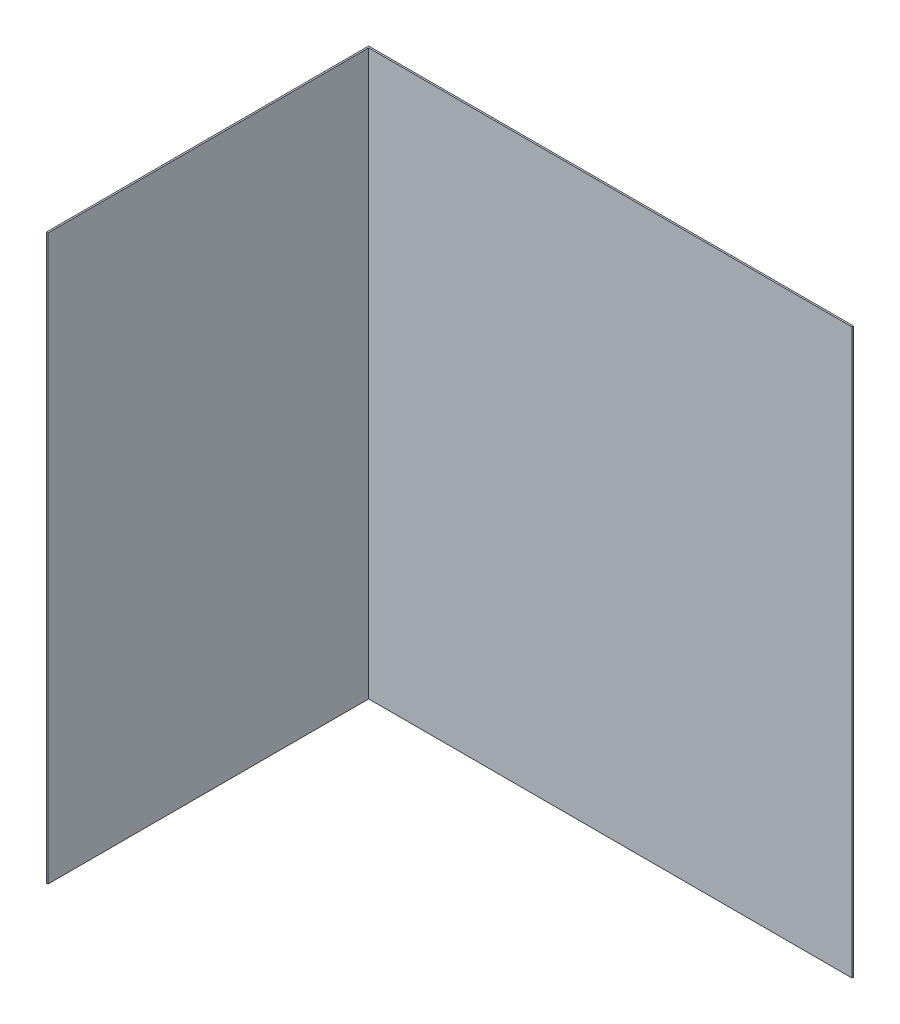
ISO-10303-21;
HEADER;
FILE_DESCRIPTION(('STEP AP214'),'2;1');
FILE_NAME('part.step','',(''),(''),'','','');
FILE_SCHEMA(('AUTOMOTIVE_DESIGN { 1 0 10303 214 1 1 1 1 }'));
ENDSEC;
DATA;
#1=APPLICATION_CONTEXT('core data for automotive mechanical design processes');
#2=APPLICATION_PROTOCOL_DEFINITION('international standard','automotive_design',2000,#1);
#3=PRODUCT_CONTEXT('',#1,'mechanical');
#4=PRODUCT('Part','Part','',(#3));
#5=PRODUCT_RELATED_PRODUCT_CATEGORY('part','',(#4));
#6=PRODUCT_DEFINITION_FORMATION('','',#4);
#7=PRODUCT_DEFINITION_CONTEXT('part definition',#1,'design');
#8=PRODUCT_DEFINITION('design','',#6,#7);
#9=PRODUCT_DEFINITION_SHAPE('','',#8);
#10=(LENGTH_UNIT() NAMED_UNIT(*) SI_UNIT(.MILLI.,.METRE.));
#11=(NAMED_UNIT(*) PLANE_ANGLE_UNIT() SI_UNIT($,.RADIAN.));
#12=(NAMED_UNIT(*) SI_UNIT($,.STERADIAN.) SOLID_ANGLE_UNIT());
#13=UNCERTAINTY_MEASURE_WITH_UNIT(LENGTH_MEASURE(1.E-05),#10,'distance_accuracy_value','');
#14=(GEOMETRIC_REPRESENTATION_CONTEXT(3) GLOBAL_UNCERTAINTY_ASSIGNED_CONTEXT((#13)) GLOBAL_UNIT_ASSIGNED_CONTEXT((#10,
#11,#12)) REPRESENTATION_CONTEXT('',''));
#15=CARTESIAN_POINT('',(0.,0.,0.));
#16=DIRECTION('',(0.,0.,1.));
#17=DIRECTION('',(1.,0.,0.));
#18=AXIS2_PLACEMENT_3D('',#15,#16,#17);
#19=CARTESIAN_POINT('',(0.,0.,0.2));
#20=DIRECTION('',(0.,0.,-1.));
#21=DIRECTION('',(-1.,0.,0.));
#22=AXIS2_PLACEMENT_3D('',#19,#20,#21);
#23=PLANE('',#22);
#24=DIRECTION('',(-1.,0.,0.));
#25=VECTOR('',#24,1.);
#26=CARTESIAN_POINT('',(0.,0.35,0.2));
#27=LINE('',#26,#25);
#28=CARTESIAN_POINT('',(0.,0.35,0.2));
#29=VERTEX_POINT('',#28);
#30=CARTESIAN_POINT('',(-0.00100000000000002,0.35,0.2));
#31=VERTEX_POINT('',#30);
#32=EDGE_CURVE('E88',#29,#31,#27,.T.);
#33=ORIENTED_EDGE('',*,*,#32,.T.);
#34=DIRECTION('',(0.,1.,0.));
#35=VECTOR('',#34,1.);
#36=CARTESIAN_POINT('',(-0.00100000000000004,0.,0.2));
#37=LINE('',#36,#35);
#38=CARTESIAN_POINT('',(-0.00100000000000004,0.,0.2));
#39=VERTEX_POINT('',#38);
#40=EDGE_CURVE('E72',#31,#39,#37,.F.);
#41=ORIENTED_EDGE('',*,*,#40,.T.);
#42=DIRECTION('',(-1.,0.,0.));
#43=VECTOR('',#42,1.);
#44=CARTESIAN_POINT('',(0.,0.,0.2));
#45=LINE('',#44,#43);
#46=CARTESIAN_POINT('',(0.,0.,0.2));
#47=VERTEX_POINT('',#46);
#48=EDGE_CURVE('E20',#39,#47,#45,.F.);
#49=ORIENTED_EDGE('',*,*,#48,.T.);
#50=DIRECTION('',(0.,1.,0.));
#51=VECTOR('',#50,1.);
#52=CARTESIAN_POINT('',(0.,0.,0.2));
#53=LINE('',#52,#51);
#54=EDGE_CURVE('E77',#29,#47,#53,.F.);
#55=ORIENTED_EDGE('',*,*,#54,.F.);
#56=EDGE_LOOP('',(#33,#41,#49,#55));
#57=FACE_BOUND('',#56,.T.);
#58=ADVANCED_FACE('F17',(#57),#23,.F.);
#59=CARTESIAN_POINT('',(0.,0.,0.));
#60=DIRECTION('',(1.,0.,0.));
#61=DIRECTION('',(0.,0.,-1.));
#62=AXIS2_PLACEMENT_3D('',#59,#60,#61);
#63=PLANE('',#62);
#64=DIRECTION('',(0.,0.,-1.));
#65=VECTOR('',#64,1.);
#66=CARTESIAN_POINT('',(0.,0.35,0.));
#67=LINE('',#66,#65);
#68=CARTESIAN_POINT('',(0.,0.35,0.000999999999999999));
#69=VERTEX_POINT('',#68);
#70=EDGE_CURVE('E111',#69,#29,#67,.F.);
#71=ORIENTED_EDGE('',*,*,#70,.T.);
#72=ORIENTED_EDGE('',*,*,#54,.T.);
#73=DIRECTION('',(0.,0.,-1.));
#74=VECTOR('',#73,1.);
#75=CARTESIAN_POINT('',(0.,0.,0.));
#76=LINE('',#75,#74);
#77=CARTESIAN_POINT('',(0.,0.,0.001));
#78=VERTEX_POINT('',#77);
#79=EDGE_CURVE('E83',#47,#78,#76,.T.);
#80=ORIENTED_EDGE('',*,*,#79,.T.);
#81=DIRECTION('',(0.,1.,0.));
#82=VECTOR('',#81,1.);
#83=CARTESIAN_POINT('',(0.,0.,0.001));
#84=LINE('',#83,#82);
#85=EDGE_CURVE('E100',#78,#69,#84,.T.);
#86=ORIENTED_EDGE('',*,*,#85,.T.);
#87=EDGE_LOOP('',(#71,#72,#80,#86));
#88=FACE_BOUND('',#87,.T.);
#89=ADVANCED_FACE('F112',(#88),#63,.T.);
#90=CARTESIAN_POINT('',(-0.001,0.35,0.));
#91=DIRECTION('',(1.,0.,0.));
#92=DIRECTION('',(0.,0.,-1.));
#93=AXIS2_PLACEMENT_3D('',#90,#91,#92);
#94=PLANE('',#93);
#95=DIRECTION('',(0.,0.,1.));
#96=VECTOR('',#95,1.);
#97=CARTESIAN_POINT('',(-0.001,0.,0.));
#98=LINE('',#97,#96);
#99=CARTESIAN_POINT('',(-0.001,0.,0.));
#100=VERTEX_POINT('',#99);
#101=EDGE_CURVE('E67',#39,#100,#98,.F.);
#102=ORIENTED_EDGE('',*,*,#101,.F.);
#103=ORIENTED_EDGE('',*,*,#40,.F.);
#104=DIRECTION('',(0.,0.,-1.));
#105=VECTOR('',#104,1.);
#106=CARTESIAN_POINT('',(-0.001,0.35,0.));
#107=LINE('',#106,#105);
#108=CARTESIAN_POINT('',(-0.001,0.35,0.));
#109=VERTEX_POINT('',#108);
#110=EDGE_CURVE('E76',#31,#109,#107,.T.);
#111=ORIENTED_EDGE('',*,*,#110,.T.);
#112=DIRECTION('',(0.,1.,0.));
#113=VECTOR('',#112,1.);
#114=CARTESIAN_POINT('',(-0.001,0.,0.));
#115=LINE('',#114,#113);
#116=EDGE_CURVE('E74',#100,#109,#115,.T.);
#117=ORIENTED_EDGE('',*,*,#116,.F.);
#118=EDGE_LOOP('',(#102,#103,#111,#117));
#119=FACE_BOUND('',#118,.T.);
#120=ADVANCED_FACE('F69',(#119),#94,.F.);
#121=CARTESIAN_POINT('',(-0.001,0.,0.001));
#122=DIRECTION('',(0.,0.,-1.));
#123=DIRECTION('',(-1.,0.,0.));
#124=AXIS2_PLACEMENT_3D('',#121,#122,#123);
#125=PLANE('',#124);
#126=DIRECTION('',(1.,0.,0.));
#127=VECTOR('',#126,1.);
#128=CARTESIAN_POINT('',(0.3,0.35,0.001));
#129=LINE('',#128,#127);
#130=CARTESIAN_POINT('',(0.3,0.35,0.001));
#131=VERTEX_POINT('',#130);
#132=EDGE_CURVE('E99',#131,#69,#129,.F.);
#133=ORIENTED_EDGE('',*,*,#132,.T.);
#134=ORIENTED_EDGE('',*,*,#85,.F.);
#135=DIRECTION('',(1.,0.,0.));
#136=VECTOR('',#135,1.);
#137=CARTESIAN_POINT('',(-0.001,0.,0.001));
#138=LINE('',#137,#136);
#139=CARTESIAN_POINT('',(0.3,0.,0.001));
#140=VERTEX_POINT('',#139);
#141=EDGE_CURVE('E102',#78,#140,#138,.T.);
#142=ORIENTED_EDGE('',*,*,#141,.T.);
#143=DIRECTION('',(0.,1.,0.));
#144=VECTOR('',#143,1.);
#145=CARTESIAN_POINT('',(0.3,0.,0.001));
#146=LINE('',#145,#144);
#147=EDGE_CURVE('E95',#140,#131,#146,.T.);
#148=ORIENTED_EDGE('',*,*,#147,.T.);
#149=EDGE_LOOP('',(#133,#134,#142,#148));
#150=FACE_BOUND('',#149,.T.);
#151=ADVANCED_FACE('F114',(#150),#125,.F.);
#152=CARTESIAN_POINT('',(-0.001,0.,0.));
#153=DIRECTION('',(0.,1.,0.));
#154=DIRECTION('',(0.,0.,1.));
#155=AXIS2_PLACEMENT_3D('',#152,#153,#154);
#156=PLANE('',#155);
#157=ORIENTED_EDGE('',*,*,#141,.F.);
#158=ORIENTED_EDGE('',*,*,#79,.F.);
#159=ORIENTED_EDGE('',*,*,#48,.F.);
#160=ORIENTED_EDGE('',*,*,#101,.T.);
#161=DIRECTION('',(-1.,0.,0.));
#162=VECTOR('',#161,1.);
#163=CARTESIAN_POINT('',(-0.001,0.,0.));
#164=LINE('',#163,#162);
#165=CARTESIAN_POINT('',(0.3,0.,0.));
#166=VERTEX_POINT('',#165);
#167=EDGE_CURVE('E94',#166,#100,#164,.T.);
#168=ORIENTED_EDGE('',*,*,#167,.F.);
#169=DIRECTION('',(0.,0.,1.));
#170=VECTOR('',#169,1.);
#171=CARTESIAN_POINT('',(0.3,0.,0.));
#172=LINE('',#171,#170);
#173=EDGE_CURVE('E96',#166,#140,#172,.T.);
#174=ORIENTED_EDGE('',*,*,#173,.T.);
#175=EDGE_LOOP('',(#157,#158,#159,#160,#168,#174));
#176=FACE_BOUND('',#175,.T.);
#177=ADVANCED_FACE('F82',(#176),#156,.F.);
#178=CARTESIAN_POINT('',(0.3,0.35,0.));
#179=DIRECTION('',(0.,-1.,0.));
#180=DIRECTION('',(0.,0.,-1.));
#181=AXIS2_PLACEMENT_3D('',#178,#179,#180);
#182=PLANE('',#181);
#183=ORIENTED_EDGE('',*,*,#132,.F.);
#184=DIRECTION('',(0.,0.,-1.));
#185=VECTOR('',#184,1.);
#186=CARTESIAN_POINT('',(0.3,0.35,0.));
#187=LINE('',#186,#185);
#188=CARTESIAN_POINT('',(0.3,0.35,0.));
#189=VERTEX_POINT('',#188);
#190=EDGE_CURVE('E35',#131,#189,#187,.T.);
#191=ORIENTED_EDGE('',*,*,#190,.T.);
#192=DIRECTION('',(-1.,0.,0.));
#193=VECTOR('',#192,1.);
#194=CARTESIAN_POINT('',(-0.001,0.35,0.));
#195=LINE('',#194,#193);
#196=EDGE_CURVE('E26',#109,#189,#195,.F.);
#197=ORIENTED_EDGE('',*,*,#196,.F.);
#198=ORIENTED_EDGE('',*,*,#110,.F.);
#199=ORIENTED_EDGE('',*,*,#32,.F.);
#200=ORIENTED_EDGE('',*,*,#70,.F.);
#201=EDGE_LOOP('',(#183,#191,#197,#198,#199,#200));
#202=FACE_BOUND('',#201,.T.);
#203=ADVANCED_FACE('F127',(#202),#182,.F.);
#204=CARTESIAN_POINT('',(0.3,0.,0.));
#205=DIRECTION('',(-1.,0.,0.));
#206=DIRECTION('',(0.,0.,1.));
#207=AXIS2_PLACEMENT_3D('',#204,#205,#206);
#208=PLANE('',#207);
#209=ORIENTED_EDGE('',*,*,#190,.F.);
#210=ORIENTED_EDGE('',*,*,#147,.F.);
#211=ORIENTED_EDGE('',*,*,#173,.F.);
#212=DIRECTION('',(0.,1.,0.));
#213=VECTOR('',#212,1.);
#214=CARTESIAN_POINT('',(0.3,0.,0.));
#215=LINE('',#214,#213);
#216=EDGE_CURVE('E11',#189,#166,#215,.F.);
#217=ORIENTED_EDGE('',*,*,#216,.F.);
#218=EDGE_LOOP('',(#209,#210,#211,#217));
#219=FACE_BOUND('',#218,.T.);
#220=ADVANCED_FACE('F119',(#219),#208,.F.);
#221=CARTESIAN_POINT('',(-0.001,0.,0.));
#222=DIRECTION('',(0.,0.,-1.));
#223=DIRECTION('',(-1.,0.,0.));
#224=AXIS2_PLACEMENT_3D('',#221,#222,#223);
#225=PLANE('',#224);
#226=ORIENTED_EDGE('',*,*,#196,.T.);
#227=ORIENTED_EDGE('',*,*,#216,.T.);
#228=ORIENTED_EDGE('',*,*,#167,.T.);
#229=ORIENTED_EDGE('',*,*,#116,.T.);
#230=EDGE_LOOP('',(#226,#227,#228,#229));
#231=FACE_BOUND('',#230,.T.);
#232=ADVANCED_FACE('F126',(#231),#225,.T.);
#233=CLOSED_SHELL('',(#58,#89,#120,#151,#177,#203,#220,#232));
#234=MANIFOLD_SOLID_BREP('B1',#233);
#235=ADVANCED_BREP_SHAPE_REPRESENTATION('',(#18,#234),#14);
#236=SHAPE_DEFINITION_REPRESENTATION(#9,#235);
ENDSEC;
END-ISO-10303-21;
